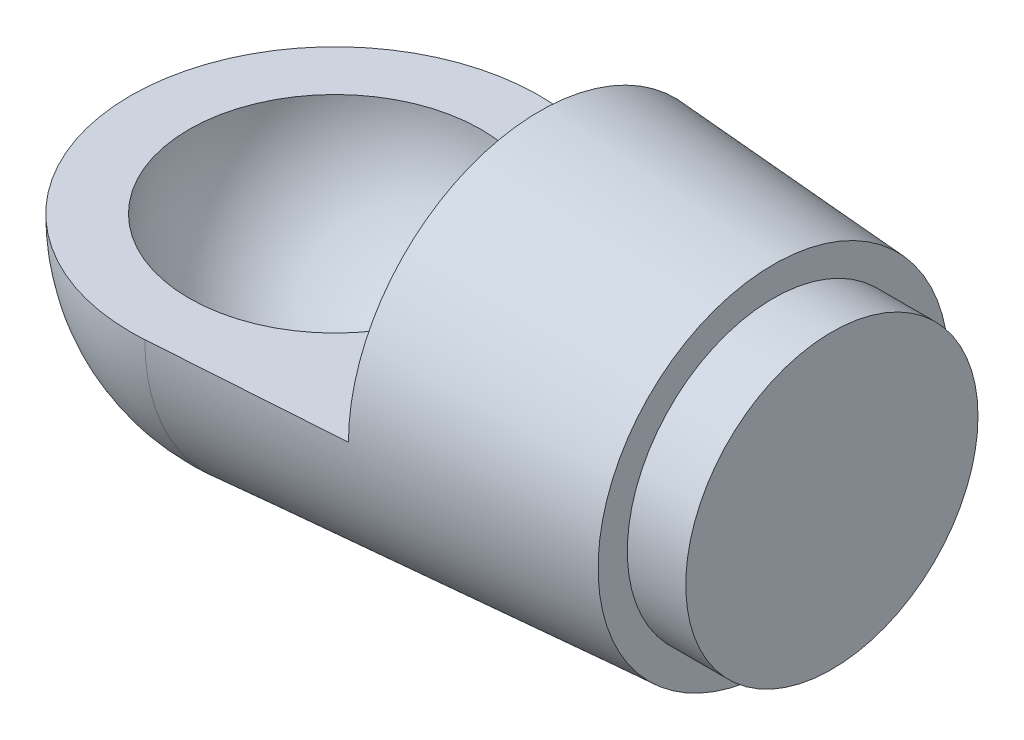
ISO-10303-21;
HEADER;
FILE_DESCRIPTION(('STEP AP214'),'2;1');
FILE_NAME('part.step','',(''),(''),'','','');
FILE_SCHEMA(('AUTOMOTIVE_DESIGN { 1 0 10303 214 1 1 1 1 }'));
ENDSEC;
DATA;
#1=APPLICATION_CONTEXT('core data for automotive mechanical design processes');
#2=APPLICATION_PROTOCOL_DEFINITION('international standard','automotive_design',2000,#1);
#3=PRODUCT_CONTEXT('',#1,'mechanical');
#4=PRODUCT('Part','Part','',(#3));
#5=PRODUCT_RELATED_PRODUCT_CATEGORY('part','',(#4));
#6=PRODUCT_DEFINITION_FORMATION('','',#4);
#7=PRODUCT_DEFINITION_CONTEXT('part definition',#1,'design');
#8=PRODUCT_DEFINITION('design','',#6,#7);
#9=PRODUCT_DEFINITION_SHAPE('','',#8);
#10=(LENGTH_UNIT() NAMED_UNIT(*) SI_UNIT(.MILLI.,.METRE.));
#11=(NAMED_UNIT(*) PLANE_ANGLE_UNIT() SI_UNIT($,.RADIAN.));
#12=(NAMED_UNIT(*) SI_UNIT($,.STERADIAN.) SOLID_ANGLE_UNIT());
#13=UNCERTAINTY_MEASURE_WITH_UNIT(LENGTH_MEASURE(1.E-05),#10,'distance_accuracy_value','');
#14=(GEOMETRIC_REPRESENTATION_CONTEXT(3) GLOBAL_UNCERTAINTY_ASSIGNED_CONTEXT((#13)) GLOBAL_UNIT_ASSIGNED_CONTEXT((#10,
#11,#12)) REPRESENTATION_CONTEXT('',''));
#15=CARTESIAN_POINT('',(0.,0.,0.));
#16=DIRECTION('',(0.,0.,1.));
#17=DIRECTION('',(1.,0.,0.));
#18=AXIS2_PLACEMENT_3D('',#15,#16,#17);
#19=CARTESIAN_POINT('',(0.,0.,0.));
#20=DIRECTION('',(0.999999999999965,0.,-2.64078082830745E-07));
#21=DIRECTION('',(-2.64078082830745E-07,0.,-0.999999999999965));
#22=AXIS2_PLACEMENT_3D('',#19,#20,#21);
#23=CONICAL_SURFACE('',#22,0.,1.57079606271681);
#24=CARTESIAN_POINT('',(1.58446849807259E-05,0.,-4.18423403481653E-12));
#25=DIRECTION('',(0.999999999999965,0.,-2.64078082830745E-07));
#26=DIRECTION('',(-2.64078082830745E-07,0.,-0.999999999999965));
#27=AXIS2_PLACEMENT_3D('',#24,#25,#26);
#28=CIRCLE('',#27,59.9999999999979);
#29=CARTESIAN_POINT('',(0.,0.,-60.));
#30=VERTEX_POINT('',#29);
#31=EDGE_CURVE('E97',#30,#30,#28,.T.);
#32=ORIENTED_EDGE('',*,*,#31,.T.);
#33=EDGE_LOOP('',(#32));
#34=FACE_BOUND('',#33,.T.);
#35=CARTESIAN_POINT('',(1.32039041536659E-05,0.,-3.48686169442503E-12));
#36=DIRECTION('',(0.999999999999965,0.,-2.64078082830745E-07));
#37=DIRECTION('',(-2.64078082830745E-07,0.,-0.999999999999965));
#38=AXIS2_PLACEMENT_3D('',#35,#36,#37);
#39=CIRCLE('',#38,49.9999999999983);
#40=CARTESIAN_POINT('',(0.,0.,-50.));
#41=VERTEX_POINT('',#40);
#42=EDGE_CURVE('E35',#41,#41,#39,.T.);
#43=ORIENTED_EDGE('',*,*,#42,.F.);
#44=EDGE_LOOP('',(#43));
#45=FACE_BOUND('',#44,.T.);
#46=ADVANCED_FACE('F32',(#34,#45),#23,.F.);
#47=CARTESIAN_POINT('',(1.58446849807259E-05,0.,-4.18423403481653E-12));
#48=DIRECTION('',(-0.999999999999965,0.,2.64078082830745E-07));
#49=DIRECTION('',(2.64078082830745E-07,0.,0.999999999999965));
#50=AXIS2_PLACEMENT_3D('',#47,#48,#49);
#51=CONICAL_SURFACE('',#50,59.9999999999979,0.0676325694242772);
#52=DIRECTION('',(-0.997713771587771,0.,0.0675812842738739));
#53=VECTOR('',#52,1.);
#54=CARTESIAN_POINT('',(885.793492442764,0.,-0.000233918647268243));
#55=LINE('',#54,#53);
#56=CARTESIAN_POINT('',(-145.269310100827,0.,69.8399851373906));
#57=VERTEX_POINT('',#56);
#58=CARTESIAN_POINT('',(-80.,0.,65.4188937122777));
#59=VERTEX_POINT('',#58);
#60=EDGE_CURVE('E75',#57,#59,#55,.F.);
#61=ORIENTED_EDGE('',*,*,#60,.F.);
#62=CARTESIAN_POINT('',(-145.269328544027,0.,3.83624457760175E-05));
#63=DIRECTION('',(0.999999999999965,0.,-2.64078082830745E-07));
#64=DIRECTION('',(-2.64078082830745E-07,0.,-0.999999999999965));
#65=AXIS2_PLACEMENT_3D('',#62,#63,#64);
#66=CIRCLE('',#65,69.8399467749472);
#67=CARTESIAN_POINT('',(-145.269346987226,0.,-69.839908412499));
#68=VERTEX_POINT('',#67);
#69=EDGE_CURVE('E93',#57,#68,#66,.T.);
#70=ORIENTED_EDGE('',*,*,#69,.T.);
#71=DIRECTION('',(0.997713807281103,0.,0.0675807573251845));
#72=VECTOR('',#71,1.);
#73=CARTESIAN_POINT('',(885.793492442764,0.,-0.000233918647268243));
#74=LINE('',#73,#72);
#75=CARTESIAN_POINT('',(-79.9999999999999,0.,-65.4188491194164));
#76=VERTEX_POINT('',#75);
#77=EDGE_CURVE('E92',#76,#68,#74,.F.);
#78=ORIENTED_EDGE('',*,*,#77,.F.);
#79=CARTESIAN_POINT('',(-80.,0.,2.2296430688605E-05));
#80=DIRECTION('',(-1.,0.,0.));
#81=DIRECTION('',(0.,0.,1.));
#82=AXIS2_PLACEMENT_3D('',#79,#80,#81);
#83=CIRCLE('',#82,65.4188714158459);
#84=EDGE_CURVE('E11',#76,#59,#83,.F.);
#85=ORIENTED_EDGE('',*,*,#84,.T.);
#86=EDGE_LOOP('',(#61,#70,#78,#85));
#87=FACE_BOUND('',#86,.T.);
#88=ORIENTED_EDGE('',*,*,#31,.F.);
#89=EDGE_LOOP('',(#88));
#90=FACE_BOUND('',#89,.T.);
#91=ADVANCED_FACE('F90',(#87,#90),#51,.T.);
#92=CARTESIAN_POINT('',(-149.999999999989,0.,5.80971782227629E-05));
#93=DIRECTION('',(0.,-1.,0.));
#94=DIRECTION('',(-2.64078082830745E-07,0.,-0.999999999999965));
#95=AXIS2_PLACEMENT_3D('',#92,#93,#94);
#96=CIRCLE('',#95,70.);
#97=TRIMMED_CURVE('',#96,(PARAMETER_VALUE(-1.57079606271681)),
(PARAMETER_VALUE(1.57079606271681)),.T.,.PARAMETER.);
#98=CARTESIAN_POINT('',(-149.999999999994,0.,3.96117124246114E-05));
#99=DIRECTION('',(0.999999999999965,0.,-2.64078082830745E-07));
#100=AXIS1_PLACEMENT('',#98,#99);
#101=SURFACE_OF_REVOLUTION('',#97,#100);
#102=CARTESIAN_POINT('',(-149.999999999989,0.,5.80971782227629E-05));
#103=DIRECTION('',(0.,-1.,0.));
#104=DIRECTION('',(0.,0.,-1.));
#105=AXIS2_PLACEMENT_3D('',#102,#103,#104);
#106=CIRCLE('',#105,70.);
#107=CARTESIAN_POINT('',(-220.,0.,5.80971782210282E-05));
#108=VERTEX_POINT('',#107);
#109=EDGE_CURVE('E95',#68,#108,#106,.F.);
#110=ORIENTED_EDGE('',*,*,#109,.F.);
#111=ORIENTED_EDGE('',*,*,#69,.F.);
#112=CARTESIAN_POINT('',(-149.999999999999,0.,2.11262466264599E-05));
#113=DIRECTION('',(0.,-1.,0.));
#114=DIRECTION('',(0.,0.,-1.));
#115=AXIS2_PLACEMENT_3D('',#112,#113,#114);
#116=CIRCLE('',#115,70.);
#117=CARTESIAN_POINT('',(-149.945615497782,0.,70.));
#118=VERTEX_POINT('',#117);
#119=EDGE_CURVE('E81',#118,#57,#116,.F.);
#120=ORIENTED_EDGE('',*,*,#119,.F.);
#121=CARTESIAN_POINT('',(-150.037088246765,0.0397760683693496,70.));
#122=CARTESIAN_POINT('',(-150.039322384588,0.0376927040712615,70.));
#123=CARTESIAN_POINT('',(-150.041382186217,0.0354191373977107,70.));
#124=CARTESIAN_POINT('',(-150.045092666588,0.030556578960322,70.));
#125=CARTESIAN_POINT('',(-150.0467428496,0.027967210600972,70.));
#126=CARTESIAN_POINT('',(-150.049583742722,0.0225489580303911,70.));
#127=CARTESIAN_POINT('',(-150.050774674552,0.0197201902039296,70.));
#128=CARTESIAN_POINT('',(-150.052665309213,0.0139038542078337,70.));
#129=CARTESIAN_POINT('',(-150.053365134034,0.0109163256727068,70.));
#130=CARTESIAN_POINT('',(-150.054252811803,0.00486575256203185,70.));
#131=CARTESIAN_POINT('',(-150.054440608068,0.00180269966354371,70.));
#132=CARTESIAN_POINT('',(-150.054299458106,-0.00431155417070727,70.));
#133=CARTESIAN_POINT('',(-150.05397049159,-0.00736275463641865,70.));
#134=CARTESIAN_POINT('',(-150.05280493358,-0.0133665674273728,70.));
#135=CARTESIAN_POINT('',(-150.051968351561,-0.0163191815916746,70.));
#136=CARTESIAN_POINT('',(-150.049811372978,-0.0220420439344559,70.));
#137=CARTESIAN_POINT('',(-150.048490977388,-0.0248122924795745,70.));
#138=CARTESIAN_POINT('',(-150.045403836657,-0.0300918004853019,70.));
#139=CARTESIAN_POINT('',(-150.043637090645,-0.0326010594365464,70.));
#140=CARTESIAN_POINT('',(-150.039707410344,-0.0372873459993207,70.));
#141=CARTESIAN_POINT('',(-150.037544476769,-0.0394643742093601,70.));
#142=CARTESIAN_POINT('',(-150.032883816439,-0.0434244068625583,70.));
#143=CARTESIAN_POINT('',(-150.030386089521,-0.0452074111151087,70.));
#144=CARTESIAN_POINT('',(-150.02512674374,-0.0483287817728877,70.));
#145=CARTESIAN_POINT('',(-150.022365124596,-0.0496671477084122,70.));
#146=CARTESIAN_POINT('',(-150.016656391475,-0.0518612467959431,70.));
#147=CARTESIAN_POINT('',(-150.013709277534,-0.0527169800433993,70.));
#148=CARTESIAN_POINT('',(-150.007713215446,-0.0539215220617532,70.));
#149=CARTESIAN_POINT('',(-150.00466426734,-0.0542703310375617,70.));
#150=CARTESIAN_POINT('',(-149.998551085724,-0.0544511236552986,70.));
#151=CARTESIAN_POINT('',(-149.99548685221,-0.0542831071806145,70.));
#152=CARTESIAN_POINT('',(-149.989430084643,-0.0534350179504258,70.));
#153=CARTESIAN_POINT('',(-149.9864375506,-0.0527549451278667,70.));
#154=CARTESIAN_POINT('',(-149.980609131704,-0.0509020485525329,70.));
#155=CARTESIAN_POINT('',(-149.977773246847,-0.049729224815676,70.));
#156=CARTESIAN_POINT('',(-149.972338628859,-0.0469241193248695,70.));
#157=CARTESIAN_POINT('',(-149.969739895719,-0.0452918375917655,70.));
#158=CARTESIAN_POINT('',(-149.964853351536,-0.0416141520139174,70.));
#159=CARTESIAN_POINT('',(-149.962565540471,-0.0395687481987427,70.));
#160=CARTESIAN_POINT('',(-149.95836578448,-0.0351228811613805,70.));
#161=CARTESIAN_POINT('',(-149.95645383957,-0.032722417923458,70.));
#162=CARTESIAN_POINT('',(-149.953060090584,-0.0276345744938641,70.));
#163=CARTESIAN_POINT('',(-149.951578286474,-0.0249471943250407,70.));
#164=CARTESIAN_POINT('',(-149.949086883284,-0.0193618040029652,70.));
#165=CARTESIAN_POINT('',(-149.948077284142,-0.0164637938773375,70.));
#166=CARTESIAN_POINT('',(-149.94655895023,-0.0105394101477686,70.));
#167=CARTESIAN_POINT('',(-149.94605021533,-0.00751303657691783,70.));
#168=CARTESIAN_POINT('',(-149.945548050956,-0.00141783380932056,70.));
#169=CARTESIAN_POINT('',(-149.945554621689,0.00165099540457828,70.));
#170=CARTESIAN_POINT('',(-149.946082882563,0.00774399394760567,70.));
#171=CARTESIAN_POINT('',(-149.946604572837,0.0107681632650646,70.));
#172=CARTESIAN_POINT('',(-149.948148262981,0.0166859907521652,70.));
#173=CARTESIAN_POINT('',(-149.949170262321,0.0195796490595496,70.));
#174=CARTESIAN_POINT('',(-149.951685558249,0.0251543143518208,70.));
#175=CARTESIAN_POINT('',(-149.953178854669,0.0278353214121004,70.));
#176=CARTESIAN_POINT('',(-149.956594357857,0.0329085851831839,70.));
#177=CARTESIAN_POINT('',(-149.958516565398,0.0353008413735688,70.));
#178=CARTESIAN_POINT('',(-149.962735319359,0.0397286807093314,70.));
#179=CARTESIAN_POINT('',(-149.965031865101,0.0417642645010213,70.));
#180=CARTESIAN_POINT('',(-149.969934111069,0.0454209984606934,70.));
#181=CARTESIAN_POINT('',(-149.972539811917,0.0470421477950116,70.));
#182=CARTESIAN_POINT('',(-149.977986446568,0.0498239595410956,70.));
#183=CARTESIAN_POINT('',(-149.980827384783,0.0509846133162776,70.));
#184=CARTESIAN_POINT('',(-149.986663691042,0.0528126089308108,70.));
#185=CARTESIAN_POINT('',(-149.989659053021,0.0534799701359503,70.));
#186=CARTESIAN_POINT('',(-149.995718935179,0.0543017075042864,70.));
#187=CARTESIAN_POINT('',(-149.998783447671,0.0544561404146327,70.));
#188=CARTESIAN_POINT('',(-150.004895852125,0.0542492713141408,70.));
#189=CARTESIAN_POINT('',(-150.007943739766,0.0538878411079712,70.));
#190=CARTESIAN_POINT('',(-150.013936635177,0.0526576540952541,70.));
#191=CARTESIAN_POINT('',(-150.016881592474,0.0517886519960367,70.));
#192=CARTESIAN_POINT('',(-150.022581196874,0.0495690413964214,70.));
#193=CARTESIAN_POINT('',(-150.025336068646,0.0482190134965765,70.));
#194=CARTESIAN_POINT('',(-150.029593884211,0.0456675965310361,70.));
#195=CARTESIAN_POINT('',(-150.031178816027,0.0446004016333598,70.));
#196=CARTESIAN_POINT('',(-150.034227940288,0.0423055853364182,70.));
#197=CARTESIAN_POINT('',(-150.035692132733,0.0410779639371262,70.));
#198=CARTESIAN_POINT('',(-150.037088246765,0.0397760683693496,70.));
#199=B_SPLINE_CURVE_WITH_KNOTS('',3,(#121,#122,#123,#124,#125,#126,#127,#128,#129,#130,#131,
#132,#133,#134,#135,#136,#137,#138,#139,#140,#141,#142,#143,#144,#145,#146,#147,#148,#149,#150,
#151,#152,#153,#154,#155,#156,#157,#158,#159,#160,#161,#162,#163,#164,#165,#166,#167,#168,#169,
#170,#171,#172,#173,#174,#175,#176,#177,#178,#179,#180,#181,#182,#183,#184,#185,#186,#187,#188,
#189,#190,#191,#192,#193,#194,#195,#196,#197,#198),.UNSPECIFIED.,.T.,.F.,(4,2,2,2,2,2,2,2,2,2,2,
2,2,2,2,2,2,2,2,2,2,2,2,2,2,2,2,2,2,2,2,2,2,2,2,2,2,2,4),(0.,0.00915743492113946,
0.0183258989246024,0.0274899309783885,0.0366516858880746,0.0458144549948485,0.0549775838487467,
0.0641405416752155,0.0733034810793372,0.0824664383661092,0.0916293791457323,0.100792324357907,
0.109955279249543,0.11911823232903,0.128281181704635,0.137444133147698,0.146607085790663,
0.155770038137628,0.164932990068869,0.174095941344268,0.183258893025737,0.192421843977532,
0.201584793727587,0.210747741115569,0.219910692205552,0.229073645689773,0.23823658950308,
0.247399530067762,0.256562487146671,0.26572542762157,0.27488838652822,0.284051517277837,
0.293214288280145,0.302376045537522,0.311540079947472,0.320708546700005,0.329865984347636,
0.335588470782195,0.341310957217704),.UNSPECIFIED.);
#200=CARTESIAN_POINT('',(-150.054384502215,0.,70.));
#201=VERTEX_POINT('',#200);
#202=EDGE_CURVE('E40',#118,#201,#199,.T.);
#203=ORIENTED_EDGE('',*,*,#202,.T.);
#204=EDGE_CURVE('E85',#108,#201,#116,.F.);
#205=ORIENTED_EDGE('',*,*,#204,.F.);
#206=EDGE_LOOP('',(#110,#111,#120,#203,#205));
#207=FACE_BOUND('',#206,.T.);
#208=ADVANCED_FACE('F112',(#207),#101,.T.);
#209=CARTESIAN_POINT('',(-80.,80.,70.));
#210=DIRECTION('',(-1.,0.,0.));
#211=DIRECTION('',(0.,0.,1.));
#212=AXIS2_PLACEMENT_3D('',#209,#210,#211);
#213=PLANE('',#212);
#214=DIRECTION('',(0.,0.,-1.));
#215=VECTOR('',#214,1.);
#216=CARTESIAN_POINT('',(-80.,0.,70.));
#217=LINE('',#216,#215);
#218=EDGE_CURVE('E78',#59,#76,#217,.T.);
#219=ORIENTED_EDGE('',*,*,#218,.F.);
#220=ORIENTED_EDGE('',*,*,#84,.F.);
#221=EDGE_LOOP('',(#219,#220));
#222=FACE_BOUND('',#221,.T.);
#223=ADVANCED_FACE('F88',(#222),#213,.T.);
#224=CARTESIAN_POINT('',(-220.,80.,70.));
#225=DIRECTION('',(0.,0.,-1.));
#226=DIRECTION('',(-1.,0.,0.));
#227=AXIS2_PLACEMENT_3D('',#224,#225,#226);
#228=PLANE('',#227);
#229=DIRECTION('',(1.,0.,0.));
#230=VECTOR('',#229,1.);
#231=CARTESIAN_POINT('',(-220.,0.,70.));
#232=LINE('',#231,#230);
#233=EDGE_CURVE('E47',#201,#118,#232,.T.);
#234=ORIENTED_EDGE('',*,*,#233,.F.);
#235=ORIENTED_EDGE('',*,*,#202,.F.);
#236=EDGE_LOOP('',(#234,#235));
#237=FACE_BOUND('',#236,.T.);
#238=ADVANCED_FACE('F115',(#237),#228,.T.);
#239=CARTESIAN_POINT('',(0.,0.,0.));
#240=DIRECTION('',(0.,-1.,0.));
#241=DIRECTION('',(0.,0.,-1.));
#242=AXIS2_PLACEMENT_3D('',#239,#240,#241);
#243=PLANE('',#242);
#244=ORIENTED_EDGE('',*,*,#77,.T.);
#245=ORIENTED_EDGE('',*,*,#109,.T.);
#246=ORIENTED_EDGE('',*,*,#204,.T.);
#247=ORIENTED_EDGE('',*,*,#233,.T.);
#248=ORIENTED_EDGE('',*,*,#119,.T.);
#249=ORIENTED_EDGE('',*,*,#60,.T.);
#250=ORIENTED_EDGE('',*,*,#218,.T.);
#251=EDGE_LOOP('',(#244,#245,#246,#247,#248,#249,#250));
#252=FACE_BOUND('',#251,.T.);
#253=CARTESIAN_POINT('',(-149.999999999989,0.,5.80971782227629E-05));
#254=DIRECTION('',(0.,-1.,0.));
#255=DIRECTION('',(0.,0.,-1.));
#256=AXIS2_PLACEMENT_3D('',#253,#254,#255);
#257=CIRCLE('',#256,50.);
#258=CARTESIAN_POINT('',(-199.999999999989,0.,5.28156165661478E-05));
#259=VERTEX_POINT('',#258);
#260=CARTESIAN_POINT('',(-99.9999999999987,0.,2.64078082865794E-05));
#261=VERTEX_POINT('',#260);
#262=EDGE_CURVE('E54',#259,#261,#257,.T.);
#263=ORIENTED_EDGE('',*,*,#262,.T.);
#264=CARTESIAN_POINT('',(-149.999999999999,0.,2.11262466264599E-05));
#265=DIRECTION('',(0.,-1.,0.));
#266=DIRECTION('',(0.,0.,-1.));
#267=AXIS2_PLACEMENT_3D('',#264,#265,#266);
#268=CIRCLE('',#267,50.);
#269=EDGE_CURVE('E103',#261,#259,#268,.T.);
#270=ORIENTED_EDGE('',*,*,#269,.T.);
#271=EDGE_LOOP('',(#263,#270));
#272=FACE_BOUND('',#271,.T.);
#273=ADVANCED_FACE('F77',(#252,#272),#243,.F.);
#274=CARTESIAN_POINT('',(-149.999999999989,0.,5.80971782227629E-05));
#275=DIRECTION('',(0.,-1.,0.));
#276=DIRECTION('',(-2.64078082830745E-07,0.,-0.999999999999965));
#277=AXIS2_PLACEMENT_3D('',#274,#275,#276);
#278=CIRCLE('',#277,50.);
#279=TRIMMED_CURVE('',#278,(PARAMETER_VALUE(-1.57079595708558)),
(PARAMETER_VALUE(1.57079595708558)),.T.,.PARAMETER.);
#280=CARTESIAN_POINT('',(-149.999999999994,0.,3.96117124246114E-05));
#281=DIRECTION('',(0.999999999999965,0.,-2.64078082830745E-07));
#282=AXIS1_PLACEMENT('',#280,#281);
#283=SURFACE_OF_REVOLUTION('',#279,#282);
#284=ORIENTED_EDGE('',*,*,#262,.F.);
#285=ORIENTED_EDGE('',*,*,#269,.F.);
#286=EDGE_LOOP('',(#284,#285));
#287=FACE_BOUND('',#286,.T.);
#288=ADVANCED_FACE('F123',(#287),#283,.F.);
#289=CARTESIAN_POINT('',(20.,0.,0.));
#290=DIRECTION('',(-1.,0.,0.));
#291=DIRECTION('',(0.,0.,1.));
#292=AXIS2_PLACEMENT_3D('',#289,#290,#291);
#293=CYLINDRICAL_SURFACE('',#292,50.);
#294=ORIENTED_EDGE('',*,*,#42,.T.);
#295=EDGE_LOOP('',(#294));
#296=FACE_BOUND('',#295,.T.);
#297=CARTESIAN_POINT('',(20.,0.,0.));
#298=DIRECTION('',(1.,0.,0.));
#299=DIRECTION('',(0.,0.,-1.));
#300=AXIS2_PLACEMENT_3D('',#297,#298,#299);
#301=CIRCLE('',#300,50.);
#302=CARTESIAN_POINT('',(20.,0.,-50.));
#303=VERTEX_POINT('',#302);
#304=EDGE_CURVE('E142',#303,#303,#301,.T.);
#305=ORIENTED_EDGE('',*,*,#304,.F.);
#306=EDGE_LOOP('',(#305));
#307=FACE_BOUND('',#306,.T.);
#308=ADVANCED_FACE('F125',(#296,#307),#293,.T.);
#309=CARTESIAN_POINT('',(20.,0.,0.));
#310=DIRECTION('',(1.,0.,0.));
#311=DIRECTION('',(0.,0.,-1.));
#312=AXIS2_PLACEMENT_3D('',#309,#310,#311);
#313=PLANE('',#312);
#314=ORIENTED_EDGE('',*,*,#304,.T.);
#315=EDGE_LOOP('',(#314));
#316=FACE_BOUND('',#315,.T.);
#317=ADVANCED_FACE('F131',(#316),#313,.T.);
#318=CLOSED_SHELL('',(#46,#91,#208,#223,#238,#273,#288,#308,#317));
#319=MANIFOLD_SOLID_BREP('B2',#318);
#320=ADVANCED_BREP_SHAPE_REPRESENTATION('',(#18,#319),#14);
#321=SHAPE_DEFINITION_REPRESENTATION(#9,#320);
ENDSEC;
END-ISO-10303-21;
